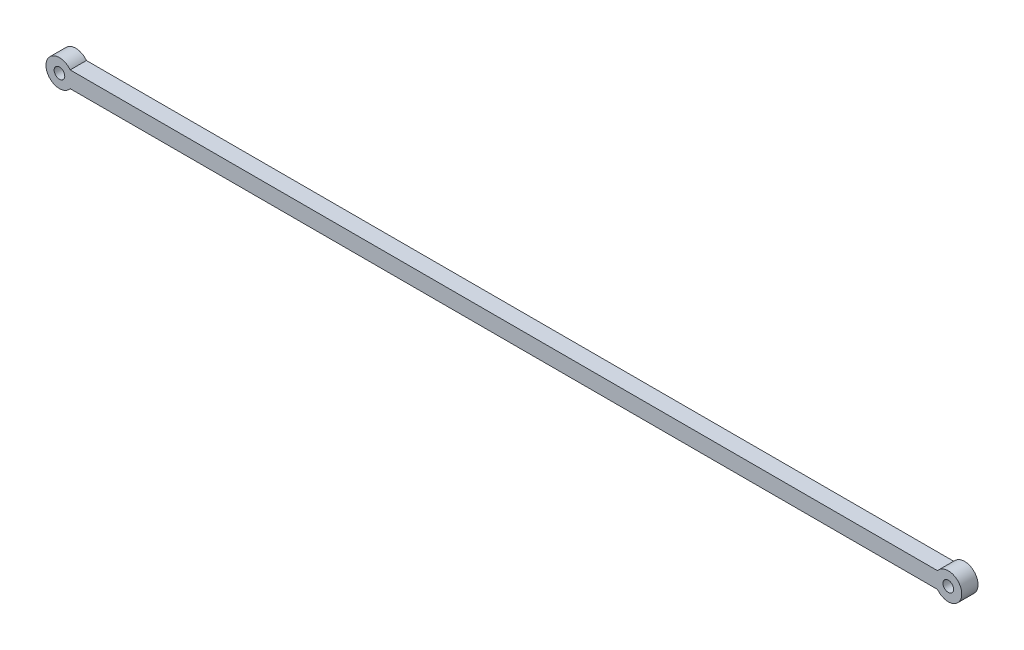
ISO-10303-21;
HEADER;
FILE_DESCRIPTION(('STEP AP214'),'2;1');
FILE_NAME('part.step','',(''),(''),'','','');
FILE_SCHEMA(('AUTOMOTIVE_DESIGN { 1 0 10303 214 1 1 1 1 }'));
ENDSEC;
DATA;
#1=APPLICATION_CONTEXT('core data for automotive mechanical design processes');
#2=APPLICATION_PROTOCOL_DEFINITION('international standard','automotive_design',2000,#1);
#3=PRODUCT_CONTEXT('',#1,'mechanical');
#4=PRODUCT('Part','Part','',(#3));
#5=PRODUCT_RELATED_PRODUCT_CATEGORY('part','',(#4));
#6=PRODUCT_DEFINITION_FORMATION('','',#4);
#7=PRODUCT_DEFINITION_CONTEXT('part definition',#1,'design');
#8=PRODUCT_DEFINITION('design','',#6,#7);
#9=PRODUCT_DEFINITION_SHAPE('','',#8);
#10=(LENGTH_UNIT() NAMED_UNIT(*) SI_UNIT(.MILLI.,.METRE.));
#11=(NAMED_UNIT(*) PLANE_ANGLE_UNIT() SI_UNIT($,.RADIAN.));
#12=(NAMED_UNIT(*) SI_UNIT($,.STERADIAN.) SOLID_ANGLE_UNIT());
#13=UNCERTAINTY_MEASURE_WITH_UNIT(LENGTH_MEASURE(1.E-05),#10,'distance_accuracy_value','');
#14=(GEOMETRIC_REPRESENTATION_CONTEXT(3) GLOBAL_UNCERTAINTY_ASSIGNED_CONTEXT((#13)) GLOBAL_UNIT_ASSIGNED_CONTEXT((#10,
#11,#12)) REPRESENTATION_CONTEXT('',''));
#15=CARTESIAN_POINT('',(0.,0.,0.));
#16=DIRECTION('',(0.,0.,1.));
#17=DIRECTION('',(1.,0.,0.));
#18=AXIS2_PLACEMENT_3D('',#15,#16,#17);
#19=CARTESIAN_POINT('',(-610.888476575822,10.97625,10.97625));
#20=DIRECTION('',(0.,1.,0.));
#21=DIRECTION('',(0.,0.,1.));
#22=AXIS2_PLACEMENT_3D('',#19,#20,#21);
#23=PLANE('',#22);
#24=DIRECTION('',(1.,0.,0.));
#25=VECTOR('',#24,1.);
#26=CARTESIAN_POINT('',(-610.888476575822,10.97625,-10.97625));
#27=LINE('',#26,#25);
#28=CARTESIAN_POINT('',(-610.888476575822,10.97625,-10.97625));
#29=VERTEX_POINT('',#28);
#30=CARTESIAN_POINT('',(560.184251223709,10.97625,-10.97625));
#31=VERTEX_POINT('',#30);
#32=EDGE_CURVE('E141',#29,#31,#27,.T.);
#33=ORIENTED_EDGE('',*,*,#32,.F.);
#34=DIRECTION('',(0.,0.,-1.));
#35=VECTOR('',#34,1.);
#36=CARTESIAN_POINT('',(-610.888476575822,10.97625,10.97625));
#37=LINE('',#36,#35);
#38=CARTESIAN_POINT('',(-610.888476575822,10.97625,10.97625));
#39=VERTEX_POINT('',#38);
#40=EDGE_CURVE('E95',#39,#29,#37,.T.);
#41=ORIENTED_EDGE('',*,*,#40,.F.);
#42=DIRECTION('',(1.,0.,0.));
#43=VECTOR('',#42,1.);
#44=CARTESIAN_POINT('',(-610.888476575822,10.97625,10.97625));
#45=LINE('',#44,#43);
#46=CARTESIAN_POINT('',(560.184251223709,10.97625,10.97625));
#47=VERTEX_POINT('',#46);
#48=EDGE_CURVE('E140',#39,#47,#45,.T.);
#49=ORIENTED_EDGE('',*,*,#48,.T.);
#50=DIRECTION('',(0.,0.,-1.));
#51=VECTOR('',#50,1.);
#52=CARTESIAN_POINT('',(560.184251223709,10.97625,10.97625));
#53=LINE('',#52,#51);
#54=EDGE_CURVE('E108',#47,#31,#53,.T.);
#55=ORIENTED_EDGE('',*,*,#54,.T.);
#56=EDGE_LOOP('',(#33,#41,#49,#55));
#57=FACE_BOUND('',#56,.T.);
#58=ADVANCED_FACE('F75',(#57),#23,.T.);
#59=CARTESIAN_POINT('',(-610.888476575822,-10.97625,10.97625));
#60=DIRECTION('',(0.,1.,0.));
#61=DIRECTION('',(0.,0.,1.));
#62=AXIS2_PLACEMENT_3D('',#59,#60,#61);
#63=PLANE('',#62);
#64=DIRECTION('',(1.,0.,0.));
#65=VECTOR('',#64,1.);
#66=CARTESIAN_POINT('',(-610.888476575822,-10.97625,-10.97625));
#67=LINE('',#66,#65);
#68=CARTESIAN_POINT('',(-610.888476575822,-10.97625,-10.97625));
#69=VERTEX_POINT('',#68);
#70=CARTESIAN_POINT('',(560.184251223709,-10.97625,-10.97625));
#71=VERTEX_POINT('',#70);
#72=EDGE_CURVE('E126',#69,#71,#67,.T.);
#73=ORIENTED_EDGE('',*,*,#72,.T.);
#74=DIRECTION('',(0.,0.,-1.));
#75=VECTOR('',#74,1.);
#76=CARTESIAN_POINT('',(560.184251223709,-10.97625,10.97625));
#77=LINE('',#76,#75);
#78=CARTESIAN_POINT('',(560.184251223709,-10.97625,10.97625));
#79=VERTEX_POINT('',#78);
#80=EDGE_CURVE('E86',#79,#71,#77,.T.);
#81=ORIENTED_EDGE('',*,*,#80,.F.);
#82=DIRECTION('',(1.,0.,0.));
#83=VECTOR('',#82,1.);
#84=CARTESIAN_POINT('',(-610.888476575822,-10.97625,10.97625));
#85=LINE('',#84,#83);
#86=CARTESIAN_POINT('',(-610.888476575822,-10.97625,10.97625));
#87=VERTEX_POINT('',#86);
#88=EDGE_CURVE('E124',#87,#79,#85,.T.);
#89=ORIENTED_EDGE('',*,*,#88,.F.);
#90=DIRECTION('',(0.,0.,-1.));
#91=VECTOR('',#90,1.);
#92=CARTESIAN_POINT('',(-610.888476575822,-10.97625,10.97625));
#93=LINE('',#92,#91);
#94=EDGE_CURVE('E12',#87,#69,#93,.T.);
#95=ORIENTED_EDGE('',*,*,#94,.T.);
#96=EDGE_LOOP('',(#73,#81,#89,#95));
#97=FACE_BOUND('',#96,.T.);
#98=ADVANCED_FACE('F122',(#97),#63,.F.);
#99=CARTESIAN_POINT('',(0.,0.,-10.97625));
#100=DIRECTION('',(0.,0.,1.));
#101=DIRECTION('',(1.,0.,0.));
#102=AXIS2_PLACEMENT_3D('',#99,#100,#101);
#103=PLANE('',#102);
#104=CARTESIAN_POINT('',(-625.352112676056,0.,-10.97625));
#105=DIRECTION('',(0.,0.,1.));
#106=DIRECTION('',(1.,0.,0.));
#107=AXIS2_PLACEMENT_3D('',#104,#105,#106);
#108=CIRCLE('',#107,7.1807);
#109=CARTESIAN_POINT('',(-618.171412676056,0.,-10.97625));
#110=VERTEX_POINT('',#109);
#111=EDGE_CURVE('E165',#110,#110,#108,.T.);
#112=ORIENTED_EDGE('',*,*,#111,.T.);
#113=EDGE_LOOP('',(#112));
#114=FACE_BOUND('',#113,.T.);
#115=CARTESIAN_POINT('',(574.647887323944,0.,-10.97625));
#116=DIRECTION('',(0.,0.,1.));
#117=DIRECTION('',(1.,0.,0.));
#118=AXIS2_PLACEMENT_3D('',#115,#116,#117);
#119=CIRCLE('',#118,7.1807);
#120=CARTESIAN_POINT('',(581.828587323944,0.,-10.97625));
#121=VERTEX_POINT('',#120);
#122=EDGE_CURVE('E149',#121,#121,#119,.T.);
#123=ORIENTED_EDGE('',*,*,#122,.T.);
#124=EDGE_LOOP('',(#123));
#125=FACE_BOUND('',#124,.T.);
#126=ORIENTED_EDGE('',*,*,#72,.F.);
#127=CARTESIAN_POINT('',(-625.352112676056,0.,-10.97625));
#128=DIRECTION('',(0.,0.,1.));
#129=DIRECTION('',(1.,0.,0.));
#130=AXIS2_PLACEMENT_3D('',#127,#128,#129);
#131=CIRCLE('',#130,18.1569499999999);
#132=EDGE_CURVE('E136',#29,#69,#131,.T.);
#133=ORIENTED_EDGE('',*,*,#132,.F.);
#134=ORIENTED_EDGE('',*,*,#32,.T.);
#135=CARTESIAN_POINT('',(574.647887323944,0.,-10.97625));
#136=DIRECTION('',(0.,0.,1.));
#137=DIRECTION('',(1.,0.,0.));
#138=AXIS2_PLACEMENT_3D('',#135,#136,#137);
#139=CIRCLE('',#138,18.1569499999999);
#140=EDGE_CURVE('E79',#71,#31,#139,.T.);
#141=ORIENTED_EDGE('',*,*,#140,.F.);
#142=EDGE_LOOP('',(#126,#133,#134,#141));
#143=FACE_BOUND('',#142,.T.);
#144=ADVANCED_FACE('F163',(#114,#125,#143),#103,.F.);
#145=CARTESIAN_POINT('',(0.,0.,10.97625));
#146=DIRECTION('',(0.,0.,1.));
#147=DIRECTION('',(1.,0.,0.));
#148=AXIS2_PLACEMENT_3D('',#145,#146,#147);
#149=PLANE('',#148);
#150=CARTESIAN_POINT('',(-625.352112676056,0.,10.97625));
#151=DIRECTION('',(0.,0.,1.));
#152=DIRECTION('',(1.,0.,0.));
#153=AXIS2_PLACEMENT_3D('',#150,#151,#152);
#154=CIRCLE('',#153,7.1807);
#155=CARTESIAN_POINT('',(-618.171412676056,0.,10.97625));
#156=VERTEX_POINT('',#155);
#157=EDGE_CURVE('E168',#156,#156,#154,.T.);
#158=ORIENTED_EDGE('',*,*,#157,.F.);
#159=EDGE_LOOP('',(#158));
#160=FACE_BOUND('',#159,.T.);
#161=CARTESIAN_POINT('',(574.647887323944,0.,10.97625));
#162=DIRECTION('',(0.,0.,1.));
#163=DIRECTION('',(1.,0.,0.));
#164=AXIS2_PLACEMENT_3D('',#161,#162,#163);
#165=CIRCLE('',#164,7.1807);
#166=CARTESIAN_POINT('',(581.828587323944,0.,10.97625));
#167=VERTEX_POINT('',#166);
#168=EDGE_CURVE('E174',#167,#167,#165,.T.);
#169=ORIENTED_EDGE('',*,*,#168,.F.);
#170=EDGE_LOOP('',(#169));
#171=FACE_BOUND('',#170,.T.);
#172=ORIENTED_EDGE('',*,*,#48,.F.);
#173=CARTESIAN_POINT('',(-625.352112676056,0.,10.97625));
#174=DIRECTION('',(0.,0.,1.));
#175=DIRECTION('',(1.,0.,0.));
#176=AXIS2_PLACEMENT_3D('',#173,#174,#175);
#177=CIRCLE('',#176,18.1569499999999);
#178=EDGE_CURVE('E138',#39,#87,#177,.T.);
#179=ORIENTED_EDGE('',*,*,#178,.T.);
#180=ORIENTED_EDGE('',*,*,#88,.T.);
#181=CARTESIAN_POINT('',(574.647887323944,0.,10.97625));
#182=DIRECTION('',(0.,0.,1.));
#183=DIRECTION('',(1.,0.,0.));
#184=AXIS2_PLACEMENT_3D('',#181,#182,#183);
#185=CIRCLE('',#184,18.1569499999999);
#186=EDGE_CURVE('E132',#79,#47,#185,.T.);
#187=ORIENTED_EDGE('',*,*,#186,.T.);
#188=EDGE_LOOP('',(#172,#179,#180,#187));
#189=FACE_BOUND('',#188,.T.);
#190=ADVANCED_FACE('F137',(#160,#171,#189),#149,.T.);
#191=CARTESIAN_POINT('',(574.647887323944,0.,10.97625));
#192=DIRECTION('',(0.,0.,-1.));
#193=DIRECTION('',(-1.,0.,0.));
#194=AXIS2_PLACEMENT_3D('',#191,#192,#193);
#195=CYLINDRICAL_SURFACE('',#194,18.1569499999999);
#196=ORIENTED_EDGE('',*,*,#80,.T.);
#197=ORIENTED_EDGE('',*,*,#140,.T.);
#198=ORIENTED_EDGE('',*,*,#54,.F.);
#199=ORIENTED_EDGE('',*,*,#186,.F.);
#200=EDGE_LOOP('',(#196,#197,#198,#199));
#201=FACE_BOUND('',#200,.T.);
#202=ADVANCED_FACE('F77',(#201),#195,.T.);
#203=CARTESIAN_POINT('',(-625.352112676056,0.,10.97625));
#204=DIRECTION('',(0.,0.,-1.));
#205=DIRECTION('',(-1.,0.,0.));
#206=AXIS2_PLACEMENT_3D('',#203,#204,#205);
#207=CYLINDRICAL_SURFACE('',#206,18.1569499999999);
#208=ORIENTED_EDGE('',*,*,#132,.T.);
#209=ORIENTED_EDGE('',*,*,#94,.F.);
#210=ORIENTED_EDGE('',*,*,#178,.F.);
#211=ORIENTED_EDGE('',*,*,#40,.T.);
#212=EDGE_LOOP('',(#208,#209,#210,#211));
#213=FACE_BOUND('',#212,.T.);
#214=ADVANCED_FACE('F161',(#213),#207,.T.);
#215=CARTESIAN_POINT('',(574.647887323944,0.,-10.97625));
#216=DIRECTION('',(0.,0.,1.));
#217=DIRECTION('',(1.,0.,0.));
#218=AXIS2_PLACEMENT_3D('',#215,#216,#217);
#219=CYLINDRICAL_SURFACE('',#218,7.1807);
#220=CARTESIAN_POINT('',(581.828587323944,0.,-10.97625));
#221=CARTESIAN_POINT('',(581.828587323944,0.,-10.747578125));
#222=CARTESIAN_POINT('',(581.828587323944,0.,-10.51890625));
#223=CARTESIAN_POINT('',(581.828587323944,0.,-10.0615625));
#224=CARTESIAN_POINT('',(581.828587323944,0.,-9.832890625));
#225=CARTESIAN_POINT('',(581.828587323944,0.,-9.375546875));
#226=CARTESIAN_POINT('',(581.828587323944,0.,-9.146875));
#227=CARTESIAN_POINT('',(581.828587323944,0.,-8.68953125));
#228=CARTESIAN_POINT('',(581.828587323944,0.,-8.460859375));
#229=CARTESIAN_POINT('',(581.828587323944,0.,-8.003515625));
#230=CARTESIAN_POINT('',(581.828587323944,0.,-7.77484375));
#231=CARTESIAN_POINT('',(581.828587323944,0.,-7.3175));
#232=CARTESIAN_POINT('',(581.828587323944,0.,-7.088828125));
#233=CARTESIAN_POINT('',(581.828587323944,0.,-6.631484375));
#234=CARTESIAN_POINT('',(581.828587323944,0.,-6.4028125));
#235=CARTESIAN_POINT('',(581.828587323944,0.,-5.94546875));
#236=CARTESIAN_POINT('',(581.828587323944,0.,-5.716796875));
#237=CARTESIAN_POINT('',(581.828587323944,0.,-5.259453125));
#238=CARTESIAN_POINT('',(581.828587323944,0.,-5.03078125));
#239=CARTESIAN_POINT('',(581.828587323944,0.,-4.5734375));
#240=CARTESIAN_POINT('',(581.828587323944,0.,-4.344765625));
#241=CARTESIAN_POINT('',(581.828587323944,0.,-3.887421875));
#242=CARTESIAN_POINT('',(581.828587323944,0.,-3.65875));
#243=CARTESIAN_POINT('',(581.828587323944,0.,-3.20140625));
#244=CARTESIAN_POINT('',(581.828587323944,0.,-2.972734375));
#245=CARTESIAN_POINT('',(581.828587323944,0.,-2.515390625));
#246=CARTESIAN_POINT('',(581.828587323944,0.,-2.28671875));
#247=CARTESIAN_POINT('',(581.828587323944,0.,-1.829375));
#248=CARTESIAN_POINT('',(581.828587323944,0.,-1.600703125));
#249=CARTESIAN_POINT('',(581.828587323944,0.,-1.143359375));
#250=CARTESIAN_POINT('',(581.828587323944,0.,-0.914687500000001));
#251=CARTESIAN_POINT('',(581.828587323944,0.,-0.457343750000001));
#252=CARTESIAN_POINT('',(581.828587323944,0.,-0.228671875000002));
#253=CARTESIAN_POINT('',(581.828587323944,0.,0.228671874999998));
#254=CARTESIAN_POINT('',(581.828587323944,0.,0.457343749999998));
#255=CARTESIAN_POINT('',(581.828587323944,0.,0.914687499999998));
#256=CARTESIAN_POINT('',(581.828587323944,0.,1.143359375));
#257=CARTESIAN_POINT('',(581.828587323944,0.,1.600703125));
#258=CARTESIAN_POINT('',(581.828587323944,0.,1.829375));
#259=CARTESIAN_POINT('',(581.828587323944,0.,2.28671875));
#260=CARTESIAN_POINT('',(581.828587323944,0.,2.515390625));
#261=CARTESIAN_POINT('',(581.828587323944,0.,2.972734375));
#262=CARTESIAN_POINT('',(581.828587323944,0.,3.20140625));
#263=CARTESIAN_POINT('',(581.828587323944,0.,3.65875));
#264=CARTESIAN_POINT('',(581.828587323944,0.,3.887421875));
#265=CARTESIAN_POINT('',(581.828587323944,0.,4.344765625));
#266=CARTESIAN_POINT('',(581.828587323944,0.,4.5734375));
#267=CARTESIAN_POINT('',(581.828587323944,0.,5.03078125));
#268=CARTESIAN_POINT('',(581.828587323944,0.,5.259453125));
#269=CARTESIAN_POINT('',(581.828587323944,0.,5.716796875));
#270=CARTESIAN_POINT('',(581.828587323944,0.,5.94546875));
#271=CARTESIAN_POINT('',(581.828587323944,0.,6.4028125));
#272=CARTESIAN_POINT('',(581.828587323944,0.,6.631484375));
#273=CARTESIAN_POINT('',(581.828587323944,0.,7.088828125));
#274=CARTESIAN_POINT('',(581.828587323944,0.,7.3175));
#275=CARTESIAN_POINT('',(581.828587323944,0.,7.77484375));
#276=CARTESIAN_POINT('',(581.828587323944,0.,8.003515625));
#277=CARTESIAN_POINT('',(581.828587323944,0.,8.460859375));
#278=CARTESIAN_POINT('',(581.828587323944,0.,8.68953125));
#279=CARTESIAN_POINT('',(581.828587323944,0.,9.146875));
#280=CARTESIAN_POINT('',(581.828587323944,0.,9.375546875));
#281=CARTESIAN_POINT('',(581.828587323944,0.,9.832890625));
#282=CARTESIAN_POINT('',(581.828587323944,0.,10.0615625));
#283=CARTESIAN_POINT('',(581.828587323944,0.,10.51890625));
#284=CARTESIAN_POINT('',(581.828587323944,0.,10.747578125));
#285=CARTESIAN_POINT('',(581.828587323944,0.,10.97625));
#286=B_SPLINE_CURVE_WITH_KNOTS('',3,(#220,#221,#222,#223,#224,#225,#226,#227,#228,#229,#230,
#231,#232,#233,#234,#235,#236,#237,#238,#239,#240,#241,#242,#243,#244,#245,#246,#247,#248,#249,
#250,#251,#252,#253,#254,#255,#256,#257,#258,#259,#260,#261,#262,#263,#264,#265,#266,#267,#268,
#269,#270,#271,#272,#273,#274,#275,#276,#277,#278,#279,#280,#281,#282,#283,#284,#285),
.UNSPECIFIED.,.F.,.F.,(4,2,2,2,2,2,2,2,2,2,2,2,2,2,2,2,2,2,2,2,2,2,2,2,2,2,2,2,2,2,2,2,4),(0.,
0.686015625,1.37203125,2.058046875,2.7440625,3.430078125,4.11609375,4.802109375,5.488125,
6.174140625,6.86015625,7.546171875,8.2321875,8.918203125,9.60421875,10.290234375,10.97625,
11.662265625,12.34828125,13.034296875,13.7203125,14.406328125,15.09234375,15.778359375,
16.464375,17.150390625,17.83640625,18.522421875,19.2084375,19.894453125,20.58046875,
21.266484375,21.9525),.UNSPECIFIED.);
#287=EDGE_CURVE('BSEAM185',#121,#167,#286,.T.);
#288=ORIENTED_EDGE('',*,*,#122,.F.);
#289=ORIENTED_EDGE('',*,*,#168,.T.);
#290=ORIENTED_EDGE('',*,*,#287,.T.);
#291=ORIENTED_EDGE('',*,*,#287,.F.);
#292=EDGE_LOOP('',(#288,#290,#289,#291));
#293=FACE_BOUND('',#292,.T.);
#294=ADVANCED_FACE('F185',(#293),#219,.F.);
#295=CARTESIAN_POINT('',(-625.352112676056,0.,-10.97625));
#296=DIRECTION('',(0.,0.,1.));
#297=DIRECTION('',(1.,0.,0.));
#298=AXIS2_PLACEMENT_3D('',#295,#296,#297);
#299=CYLINDRICAL_SURFACE('',#298,7.1807);
#300=CARTESIAN_POINT('',(-618.171412676056,0.,-10.97625));
#301=CARTESIAN_POINT('',(-618.171412676056,0.,-10.747578125));
#302=CARTESIAN_POINT('',(-618.171412676056,0.,-10.51890625));
#303=CARTESIAN_POINT('',(-618.171412676056,0.,-10.0615625));
#304=CARTESIAN_POINT('',(-618.171412676056,0.,-9.832890625));
#305=CARTESIAN_POINT('',(-618.171412676056,0.,-9.375546875));
#306=CARTESIAN_POINT('',(-618.171412676056,0.,-9.146875));
#307=CARTESIAN_POINT('',(-618.171412676056,0.,-8.68953125));
#308=CARTESIAN_POINT('',(-618.171412676056,0.,-8.460859375));
#309=CARTESIAN_POINT('',(-618.171412676056,0.,-8.003515625));
#310=CARTESIAN_POINT('',(-618.171412676056,0.,-7.77484375));
#311=CARTESIAN_POINT('',(-618.171412676056,0.,-7.3175));
#312=CARTESIAN_POINT('',(-618.171412676056,0.,-7.088828125));
#313=CARTESIAN_POINT('',(-618.171412676056,0.,-6.631484375));
#314=CARTESIAN_POINT('',(-618.171412676056,0.,-6.4028125));
#315=CARTESIAN_POINT('',(-618.171412676056,0.,-5.94546875));
#316=CARTESIAN_POINT('',(-618.171412676056,0.,-5.716796875));
#317=CARTESIAN_POINT('',(-618.171412676056,0.,-5.259453125));
#318=CARTESIAN_POINT('',(-618.171412676056,0.,-5.03078125));
#319=CARTESIAN_POINT('',(-618.171412676056,0.,-4.5734375));
#320=CARTESIAN_POINT('',(-618.171412676056,0.,-4.344765625));
#321=CARTESIAN_POINT('',(-618.171412676056,0.,-3.887421875));
#322=CARTESIAN_POINT('',(-618.171412676056,0.,-3.65875));
#323=CARTESIAN_POINT('',(-618.171412676056,0.,-3.20140625));
#324=CARTESIAN_POINT('',(-618.171412676056,0.,-2.972734375));
#325=CARTESIAN_POINT('',(-618.171412676056,0.,-2.515390625));
#326=CARTESIAN_POINT('',(-618.171412676056,0.,-2.28671875));
#327=CARTESIAN_POINT('',(-618.171412676056,0.,-1.829375));
#328=CARTESIAN_POINT('',(-618.171412676056,0.,-1.600703125));
#329=CARTESIAN_POINT('',(-618.171412676056,0.,-1.143359375));
#330=CARTESIAN_POINT('',(-618.171412676056,0.,-0.914687500000001));
#331=CARTESIAN_POINT('',(-618.171412676056,0.,-0.457343750000001));
#332=CARTESIAN_POINT('',(-618.171412676056,0.,-0.228671875000002));
#333=CARTESIAN_POINT('',(-618.171412676056,0.,0.228671874999998));
#334=CARTESIAN_POINT('',(-618.171412676056,0.,0.457343749999998));
#335=CARTESIAN_POINT('',(-618.171412676056,0.,0.914687499999998));
#336=CARTESIAN_POINT('',(-618.171412676056,0.,1.143359375));
#337=CARTESIAN_POINT('',(-618.171412676056,0.,1.600703125));
#338=CARTESIAN_POINT('',(-618.171412676056,0.,1.829375));
#339=CARTESIAN_POINT('',(-618.171412676056,0.,2.28671875));
#340=CARTESIAN_POINT('',(-618.171412676056,0.,2.515390625));
#341=CARTESIAN_POINT('',(-618.171412676056,0.,2.972734375));
#342=CARTESIAN_POINT('',(-618.171412676056,0.,3.20140625));
#343=CARTESIAN_POINT('',(-618.171412676056,0.,3.65875));
#344=CARTESIAN_POINT('',(-618.171412676056,0.,3.887421875));
#345=CARTESIAN_POINT('',(-618.171412676056,0.,4.344765625));
#346=CARTESIAN_POINT('',(-618.171412676056,0.,4.5734375));
#347=CARTESIAN_POINT('',(-618.171412676056,0.,5.03078125));
#348=CARTESIAN_POINT('',(-618.171412676056,0.,5.259453125));
#349=CARTESIAN_POINT('',(-618.171412676056,0.,5.716796875));
#350=CARTESIAN_POINT('',(-618.171412676056,0.,5.94546875));
#351=CARTESIAN_POINT('',(-618.171412676056,0.,6.4028125));
#352=CARTESIAN_POINT('',(-618.171412676056,0.,6.631484375));
#353=CARTESIAN_POINT('',(-618.171412676056,0.,7.088828125));
#354=CARTESIAN_POINT('',(-618.171412676056,0.,7.3175));
#355=CARTESIAN_POINT('',(-618.171412676056,0.,7.77484375));
#356=CARTESIAN_POINT('',(-618.171412676056,0.,8.003515625));
#357=CARTESIAN_POINT('',(-618.171412676056,0.,8.460859375));
#358=CARTESIAN_POINT('',(-618.171412676056,0.,8.68953125));
#359=CARTESIAN_POINT('',(-618.171412676056,0.,9.146875));
#360=CARTESIAN_POINT('',(-618.171412676056,0.,9.375546875));
#361=CARTESIAN_POINT('',(-618.171412676056,0.,9.832890625));
#362=CARTESIAN_POINT('',(-618.171412676056,0.,10.0615625));
#363=CARTESIAN_POINT('',(-618.171412676056,0.,10.51890625));
#364=CARTESIAN_POINT('',(-618.171412676056,0.,10.747578125));
#365=CARTESIAN_POINT('',(-618.171412676056,0.,10.97625));
#366=B_SPLINE_CURVE_WITH_KNOTS('',3,(#300,#301,#302,#303,#304,#305,#306,#307,#308,#309,#310,
#311,#312,#313,#314,#315,#316,#317,#318,#319,#320,#321,#322,#323,#324,#325,#326,#327,#328,#329,
#330,#331,#332,#333,#334,#335,#336,#337,#338,#339,#340,#341,#342,#343,#344,#345,#346,#347,#348,
#349,#350,#351,#352,#353,#354,#355,#356,#357,#358,#359,#360,#361,#362,#363,#364,#365),
.UNSPECIFIED.,.F.,.F.,(4,2,2,2,2,2,2,2,2,2,2,2,2,2,2,2,2,2,2,2,2,2,2,2,2,2,2,2,2,2,2,2,4),(0.,
0.686015625,1.37203125,2.058046875,2.7440625,3.430078125,4.11609375,4.802109375,5.488125,
6.174140625,6.86015625,7.546171875,8.2321875,8.918203125,9.60421875,10.290234375,10.97625,
11.662265625,12.34828125,13.034296875,13.7203125,14.406328125,15.09234375,15.778359375,
16.464375,17.150390625,17.83640625,18.522421875,19.2084375,19.894453125,20.58046875,
21.266484375,21.9525),.UNSPECIFIED.);
#367=EDGE_CURVE('BSEAM187',#110,#156,#366,.T.);
#368=ORIENTED_EDGE('',*,*,#111,.F.);
#369=ORIENTED_EDGE('',*,*,#157,.T.);
#370=ORIENTED_EDGE('',*,*,#367,.T.);
#371=ORIENTED_EDGE('',*,*,#367,.F.);
#372=EDGE_LOOP('',(#368,#370,#369,#371));
#373=FACE_BOUND('',#372,.T.);
#374=ADVANCED_FACE('F187',(#373),#299,.F.);
#375=CLOSED_SHELL('',(#58,#98,#144,#190,#202,#214,#294,#374));
#376=MANIFOLD_SOLID_BREP('B2',#375);
#377=ADVANCED_BREP_SHAPE_REPRESENTATION('',(#18,#376),#14);
#378=SHAPE_DEFINITION_REPRESENTATION(#9,#377);
ENDSEC;
END-ISO-10303-21;
